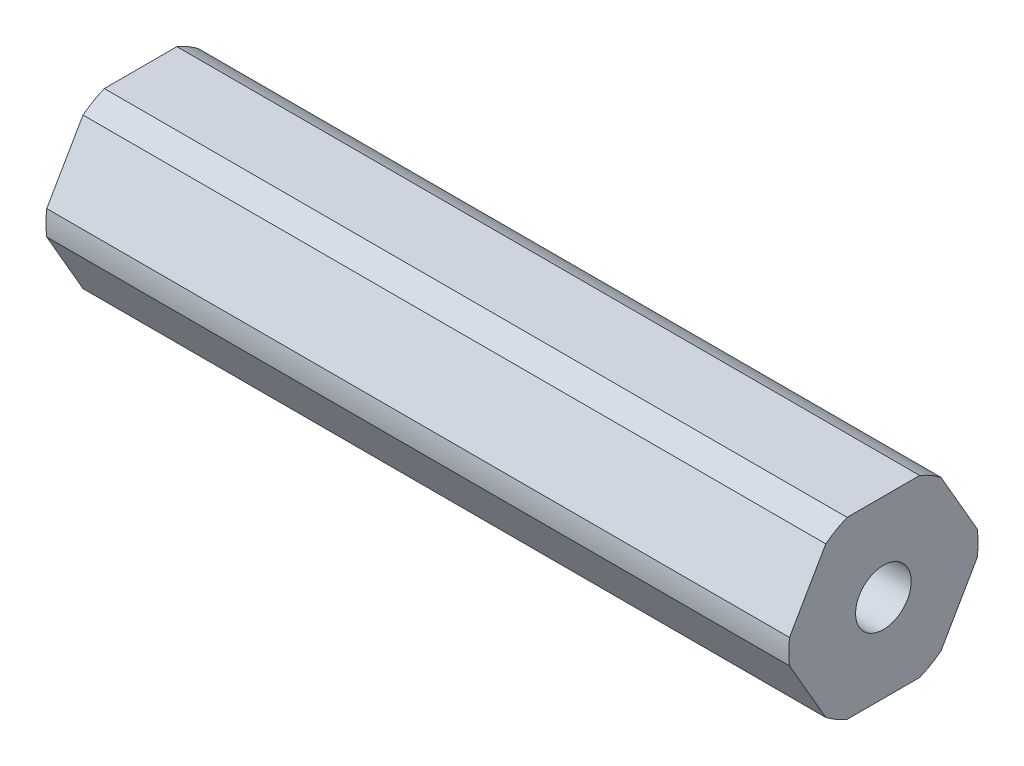
ISO-10303-21;
HEADER;
FILE_DESCRIPTION(('STEP AP214'),'2;1');
FILE_NAME('part.step','',(''),(''),'','','');
FILE_SCHEMA(('AUTOMOTIVE_DESIGN { 1 0 10303 214 1 1 1 1 }'));
ENDSEC;
DATA;
#1=APPLICATION_CONTEXT('core data for automotive mechanical design processes');
#2=APPLICATION_PROTOCOL_DEFINITION('international standard','automotive_design',2000,#1);
#3=PRODUCT_CONTEXT('',#1,'mechanical');
#4=PRODUCT('Part','Part','',(#3));
#5=PRODUCT_RELATED_PRODUCT_CATEGORY('part','',(#4));
#6=PRODUCT_DEFINITION_FORMATION('','',#4);
#7=PRODUCT_DEFINITION_CONTEXT('part definition',#1,'design');
#8=PRODUCT_DEFINITION('design','',#6,#7);
#9=PRODUCT_DEFINITION_SHAPE('','',#8);
#10=(LENGTH_UNIT() NAMED_UNIT(*) SI_UNIT(.MILLI.,.METRE.));
#11=(NAMED_UNIT(*) PLANE_ANGLE_UNIT() SI_UNIT($,.RADIAN.));
#12=(NAMED_UNIT(*) SI_UNIT($,.STERADIAN.) SOLID_ANGLE_UNIT());
#13=UNCERTAINTY_MEASURE_WITH_UNIT(LENGTH_MEASURE(1.E-05),#10,'distance_accuracy_value','');
#14=(GEOMETRIC_REPRESENTATION_CONTEXT(3) GLOBAL_UNCERTAINTY_ASSIGNED_CONTEXT((#13)) GLOBAL_UNIT_ASSIGNED_CONTEXT((#10,
#11,#12)) REPRESENTATION_CONTEXT('',''));
#15=CARTESIAN_POINT('',(0.,0.,0.));
#16=DIRECTION('',(0.,0.,1.));
#17=DIRECTION('',(1.,0.,0.));
#18=AXIS2_PLACEMENT_3D('',#15,#16,#17);
#19=CARTESIAN_POINT('',(26.9621,3.17499999999999,-5.49926131403116));
#20=DIRECTION('',(0.,-0.500000000000001,0.866025403784438));
#21=DIRECTION('',(0.,-0.866025403784438,-0.500000000000001));
#22=AXIS2_PLACEMENT_3D('',#19,#20,#21);
#23=PLANE('',#22);
#24=DIRECTION('',(0.,0.866025403784438,0.500000000000001));
#25=VECTOR('',#24,1.);
#26=CARTESIAN_POINT('',(-26.9621,3.17499999999999,-5.49926131403116));
#27=LINE('',#26,#25);
#28=CARTESIAN_POINT('',(-26.9621,0.89303957103212,-6.81675178197584));
#29=VERTEX_POINT('',#28);
#30=CARTESIAN_POINT('',(-26.9621,5.45696042896787,-4.18177084608648));
#31=VERTEX_POINT('',#30);
#32=EDGE_CURVE('E164',#29,#31,#27,.T.);
#33=ORIENTED_EDGE('',*,*,#32,.T.);
#34=DIRECTION('',(-1.,0.,0.));
#35=VECTOR('',#34,1.);
#36=CARTESIAN_POINT('',(26.9621,5.45696042896787,-4.18177084608648));
#37=LINE('',#36,#35);
#38=CARTESIAN_POINT('',(26.9621,5.45696042896787,-4.18177084608648));
#39=VERTEX_POINT('',#38);
#40=EDGE_CURVE('E11',#39,#31,#37,.T.);
#41=ORIENTED_EDGE('',*,*,#40,.F.);
#42=DIRECTION('',(0.,0.866025403784438,0.500000000000001));
#43=VECTOR('',#42,1.);
#44=CARTESIAN_POINT('',(26.9621,3.17499999999999,-5.49926131403116));
#45=LINE('',#44,#43);
#46=CARTESIAN_POINT('',(26.9621,0.89303957103212,-6.81675178197584));
#47=VERTEX_POINT('',#46);
#48=EDGE_CURVE('E223',#47,#39,#45,.T.);
#49=ORIENTED_EDGE('',*,*,#48,.F.);
#50=DIRECTION('',(-1.,0.,0.));
#51=VECTOR('',#50,1.);
#52=CARTESIAN_POINT('',(26.9621,0.89303957103212,-6.81675178197584));
#53=LINE('',#52,#51);
#54=EDGE_CURVE('E157',#47,#29,#53,.T.);
#55=ORIENTED_EDGE('',*,*,#54,.T.);
#56=EDGE_LOOP('',(#33,#41,#49,#55));
#57=FACE_BOUND('',#56,.T.);
#58=ADVANCED_FACE('F39',(#57),#23,.F.);
#59=CARTESIAN_POINT('',(26.9621,0.,0.));
#60=DIRECTION('',(-1.,0.,0.));
#61=DIRECTION('',(0.,0.,1.));
#62=AXIS2_PLACEMENT_3D('',#59,#60,#61);
#63=CYLINDRICAL_SURFACE('',#62,6.874999966);
#64=CARTESIAN_POINT('',(-26.9621,0.,0.));
#65=DIRECTION('',(1.,0.,0.));
#66=DIRECTION('',(0.,0.,-1.));
#67=AXIS2_PLACEMENT_3D('',#64,#65,#66);
#68=CIRCLE('',#67,6.874999966);
#69=CARTESIAN_POINT('',(-26.9621,6.34999999999998,-2.63498093588933));
#70=VERTEX_POINT('',#69);
#71=EDGE_CURVE('E167',#31,#70,#68,.T.);
#72=ORIENTED_EDGE('',*,*,#71,.T.);
#73=DIRECTION('',(-1.,0.,0.));
#74=VECTOR('',#73,1.);
#75=CARTESIAN_POINT('',(26.9621,6.34999999999998,-2.63498093588933));
#76=LINE('',#75,#74);
#77=CARTESIAN_POINT('',(26.9621,6.34999999999998,-2.63498093588933));
#78=VERTEX_POINT('',#77);
#79=EDGE_CURVE('E48',#78,#70,#76,.T.);
#80=ORIENTED_EDGE('',*,*,#79,.F.);
#81=CARTESIAN_POINT('',(26.9621,0.,0.));
#82=DIRECTION('',(1.,0.,0.));
#83=DIRECTION('',(0.,0.,-1.));
#84=AXIS2_PLACEMENT_3D('',#81,#82,#83);
#85=CIRCLE('',#84,6.874999966);
#86=EDGE_CURVE('E111',#39,#78,#85,.T.);
#87=ORIENTED_EDGE('',*,*,#86,.F.);
#88=ORIENTED_EDGE('',*,*,#40,.T.);
#89=EDGE_LOOP('',(#72,#80,#87,#88));
#90=FACE_BOUND('',#89,.T.);
#91=ADVANCED_FACE('F258',(#90),#63,.T.);
#92=CARTESIAN_POINT('',(26.9621,6.34999999999997,0.));
#93=DIRECTION('',(0.,-1.,0.));
#94=DIRECTION('',(0.,0.,-1.));
#95=AXIS2_PLACEMENT_3D('',#92,#93,#94);
#96=PLANE('',#95);
#97=DIRECTION('',(0.,0.,1.));
#98=VECTOR('',#97,1.);
#99=CARTESIAN_POINT('',(-26.9621,6.34999999999997,0.));
#100=LINE('',#99,#98);
#101=CARTESIAN_POINT('',(-26.9621,6.34999999999997,2.63498093588938));
#102=VERTEX_POINT('',#101);
#103=EDGE_CURVE('E169',#70,#102,#100,.T.);
#104=ORIENTED_EDGE('',*,*,#103,.T.);
#105=DIRECTION('',(-1.,0.,0.));
#106=VECTOR('',#105,1.);
#107=CARTESIAN_POINT('',(26.9621,6.34999999999997,2.63498093588938));
#108=LINE('',#107,#106);
#109=CARTESIAN_POINT('',(26.9621,6.34999999999997,2.63498093588938));
#110=VERTEX_POINT('',#109);
#111=EDGE_CURVE('E199',#110,#102,#108,.T.);
#112=ORIENTED_EDGE('',*,*,#111,.F.);
#113=DIRECTION('',(0.,0.,1.));
#114=VECTOR('',#113,1.);
#115=CARTESIAN_POINT('',(26.9621,6.34999999999997,0.));
#116=LINE('',#115,#114);
#117=EDGE_CURVE('E207',#78,#110,#116,.T.);
#118=ORIENTED_EDGE('',*,*,#117,.F.);
#119=ORIENTED_EDGE('',*,*,#79,.T.);
#120=EDGE_LOOP('',(#104,#112,#118,#119));
#121=FACE_BOUND('',#120,.T.);
#122=ADVANCED_FACE('F205',(#121),#96,.F.);
#123=CARTESIAN_POINT('',(-26.9621,5.45696042896784,4.18177084608651));
#124=VERTEX_POINT('',#123);
#125=EDGE_CURVE('E170',#102,#124,#68,.T.);
#126=ORIENTED_EDGE('',*,*,#125,.T.);
#127=DIRECTION('',(-1.,0.,0.));
#128=VECTOR('',#127,1.);
#129=CARTESIAN_POINT('',(26.9621,5.45696042896784,4.18177084608651));
#130=LINE('',#129,#128);
#131=CARTESIAN_POINT('',(26.9621,5.45696042896784,4.18177084608651));
#132=VERTEX_POINT('',#131);
#133=EDGE_CURVE('E196',#132,#124,#130,.T.);
#134=ORIENTED_EDGE('',*,*,#133,.F.);
#135=EDGE_CURVE('E229',#110,#132,#85,.T.);
#136=ORIENTED_EDGE('',*,*,#135,.F.);
#137=ORIENTED_EDGE('',*,*,#111,.T.);
#138=EDGE_LOOP('',(#126,#134,#136,#137));
#139=FACE_BOUND('',#138,.T.);
#140=ADVANCED_FACE('F240',(#139),#63,.T.);
#141=CARTESIAN_POINT('',(26.9621,3.17499999999995,5.49926131403118));
#142=DIRECTION('',(0.,-0.499999999999995,-0.866025403784442));
#143=DIRECTION('',(0.,0.866025403784442,-0.499999999999995));
#144=AXIS2_PLACEMENT_3D('',#141,#142,#143);
#145=PLANE('',#144);
#146=DIRECTION('',(0.,-0.866025403784442,0.499999999999995));
#147=VECTOR('',#146,1.);
#148=CARTESIAN_POINT('',(-26.9621,3.17499999999995,5.49926131403118));
#149=LINE('',#148,#147);
#150=CARTESIAN_POINT('',(-26.9621,0.893039571032066,6.81675178197585));
#151=VERTEX_POINT('',#150);
#152=EDGE_CURVE('E172',#124,#151,#149,.T.);
#153=ORIENTED_EDGE('',*,*,#152,.T.);
#154=DIRECTION('',(-1.,0.,0.));
#155=VECTOR('',#154,1.);
#156=CARTESIAN_POINT('',(26.9621,0.893039571032066,6.81675178197585));
#157=LINE('',#156,#155);
#158=CARTESIAN_POINT('',(26.9621,0.893039571032066,6.81675178197585));
#159=VERTEX_POINT('',#158);
#160=EDGE_CURVE('E193',#159,#151,#157,.T.);
#161=ORIENTED_EDGE('',*,*,#160,.F.);
#162=DIRECTION('',(0.,-0.866025403784442,0.499999999999995));
#163=VECTOR('',#162,1.);
#164=CARTESIAN_POINT('',(26.9621,3.17499999999995,5.49926131403118));
#165=LINE('',#164,#163);
#166=EDGE_CURVE('E231',#132,#159,#165,.T.);
#167=ORIENTED_EDGE('',*,*,#166,.F.);
#168=ORIENTED_EDGE('',*,*,#133,.T.);
#169=EDGE_LOOP('',(#153,#161,#167,#168));
#170=FACE_BOUND('',#169,.T.);
#171=ADVANCED_FACE('F242',(#170),#145,.F.);
#172=CARTESIAN_POINT('',(-26.9621,-0.893039571032163,6.81675178197583));
#173=VERTEX_POINT('',#172);
#174=EDGE_CURVE('E174',#151,#173,#68,.T.);
#175=ORIENTED_EDGE('',*,*,#174,.T.);
#176=DIRECTION('',(-1.,0.,0.));
#177=VECTOR('',#176,1.);
#178=CARTESIAN_POINT('',(26.9621,-0.893039571032163,6.81675178197583));
#179=LINE('',#178,#177);
#180=CARTESIAN_POINT('',(26.9621,-0.893039571032163,6.81675178197583));
#181=VERTEX_POINT('',#180);
#182=EDGE_CURVE('E190',#181,#173,#179,.T.);
#183=ORIENTED_EDGE('',*,*,#182,.F.);
#184=EDGE_CURVE('E232',#159,#181,#85,.T.);
#185=ORIENTED_EDGE('',*,*,#184,.F.);
#186=ORIENTED_EDGE('',*,*,#160,.T.);
#187=EDGE_LOOP('',(#175,#183,#185,#186));
#188=FACE_BOUND('',#187,.T.);
#189=ADVANCED_FACE('F243',(#188),#63,.T.);
#190=CARTESIAN_POINT('',(26.9621,-3.17500000000003,5.49926131403114));
#191=DIRECTION('',(0.,0.500000000000007,-0.866025403784435));
#192=DIRECTION('',(0.,0.866025403784435,0.500000000000007));
#193=AXIS2_PLACEMENT_3D('',#190,#191,#192);
#194=PLANE('',#193);
#195=DIRECTION('',(0.,-0.866025403784435,-0.500000000000007));
#196=VECTOR('',#195,1.);
#197=CARTESIAN_POINT('',(-26.9621,-3.17500000000003,5.49926131403114));
#198=LINE('',#197,#196);
#199=CARTESIAN_POINT('',(-26.9621,-5.4569604289679,4.18177084608644));
#200=VERTEX_POINT('',#199);
#201=EDGE_CURVE('E175',#173,#200,#198,.T.);
#202=ORIENTED_EDGE('',*,*,#201,.T.);
#203=DIRECTION('',(-1.,0.,0.));
#204=VECTOR('',#203,1.);
#205=CARTESIAN_POINT('',(26.9621,-5.4569604289679,4.18177084608644));
#206=LINE('',#205,#204);
#207=CARTESIAN_POINT('',(26.9621,-5.4569604289679,4.18177084608644));
#208=VERTEX_POINT('',#207);
#209=EDGE_CURVE('E187',#208,#200,#206,.T.);
#210=ORIENTED_EDGE('',*,*,#209,.F.);
#211=DIRECTION('',(0.,-0.866025403784435,-0.500000000000007));
#212=VECTOR('',#211,1.);
#213=CARTESIAN_POINT('',(26.9621,-3.17500000000003,5.49926131403114));
#214=LINE('',#213,#212);
#215=EDGE_CURVE('E233',#181,#208,#214,.T.);
#216=ORIENTED_EDGE('',*,*,#215,.F.);
#217=ORIENTED_EDGE('',*,*,#182,.T.);
#218=EDGE_LOOP('',(#202,#210,#216,#217));
#219=FACE_BOUND('',#218,.T.);
#220=ADVANCED_FACE('F246',(#219),#194,.F.);
#221=CARTESIAN_POINT('',(-26.9621,-6.35,2.63498093588929));
#222=VERTEX_POINT('',#221);
#223=EDGE_CURVE('E177',#200,#222,#68,.T.);
#224=ORIENTED_EDGE('',*,*,#223,.T.);
#225=DIRECTION('',(-1.,0.,0.));
#226=VECTOR('',#225,1.);
#227=CARTESIAN_POINT('',(26.9621,-6.35,2.63498093588929));
#228=LINE('',#227,#226);
#229=CARTESIAN_POINT('',(26.9621,-6.35,2.63498093588929));
#230=VERTEX_POINT('',#229);
#231=EDGE_CURVE('E184',#230,#222,#228,.T.);
#232=ORIENTED_EDGE('',*,*,#231,.F.);
#233=EDGE_CURVE('E147',#208,#230,#85,.T.);
#234=ORIENTED_EDGE('',*,*,#233,.F.);
#235=ORIENTED_EDGE('',*,*,#209,.T.);
#236=EDGE_LOOP('',(#224,#232,#234,#235));
#237=FACE_BOUND('',#236,.T.);
#238=ADVANCED_FACE('F248',(#237),#63,.T.);
#239=CARTESIAN_POINT('',(26.9621,-6.34999999999997,0.));
#240=DIRECTION('',(0.,1.,0.));
#241=DIRECTION('',(0.,0.,1.));
#242=AXIS2_PLACEMENT_3D('',#239,#240,#241);
#243=PLANE('',#242);
#244=DIRECTION('',(0.,0.,-1.));
#245=VECTOR('',#244,1.);
#246=CARTESIAN_POINT('',(-26.9621,-6.34999999999997,0.));
#247=LINE('',#246,#245);
#248=CARTESIAN_POINT('',(-26.9621,-6.34999999999994,-2.63498093588942));
#249=VERTEX_POINT('',#248);
#250=EDGE_CURVE('E178',#222,#249,#247,.T.);
#251=ORIENTED_EDGE('',*,*,#250,.T.);
#252=DIRECTION('',(-1.,0.,0.));
#253=VECTOR('',#252,1.);
#254=CARTESIAN_POINT('',(26.9621,-6.34999999999994,-2.63498093588942));
#255=LINE('',#254,#253);
#256=CARTESIAN_POINT('',(26.9621,-6.34999999999994,-2.63498093588942));
#257=VERTEX_POINT('',#256);
#258=EDGE_CURVE('E152',#257,#249,#255,.T.);
#259=ORIENTED_EDGE('',*,*,#258,.F.);
#260=DIRECTION('',(0.,0.,-1.));
#261=VECTOR('',#260,1.);
#262=CARTESIAN_POINT('',(26.9621,-6.34999999999997,0.));
#263=LINE('',#262,#261);
#264=EDGE_CURVE('E142',#230,#257,#263,.T.);
#265=ORIENTED_EDGE('',*,*,#264,.F.);
#266=ORIENTED_EDGE('',*,*,#231,.T.);
#267=EDGE_LOOP('',(#251,#259,#265,#266));
#268=FACE_BOUND('',#267,.T.);
#269=ADVANCED_FACE('F251',(#268),#243,.F.);
#270=CARTESIAN_POINT('',(-26.9621,-5.4569604289678,-4.18177084608657));
#271=VERTEX_POINT('',#270);
#272=EDGE_CURVE('E151',#249,#271,#68,.T.);
#273=ORIENTED_EDGE('',*,*,#272,.T.);
#274=DIRECTION('',(-1.,0.,0.));
#275=VECTOR('',#274,1.);
#276=CARTESIAN_POINT('',(26.9621,-5.4569604289678,-4.18177084608657));
#277=LINE('',#276,#275);
#278=CARTESIAN_POINT('',(26.9621,-5.4569604289678,-4.18177084608657));
#279=VERTEX_POINT('',#278);
#280=EDGE_CURVE('E148',#279,#271,#277,.T.);
#281=ORIENTED_EDGE('',*,*,#280,.F.);
#282=EDGE_CURVE('E136',#257,#279,#85,.T.);
#283=ORIENTED_EDGE('',*,*,#282,.F.);
#284=ORIENTED_EDGE('',*,*,#258,.T.);
#285=EDGE_LOOP('',(#273,#281,#283,#284));
#286=FACE_BOUND('',#285,.T.);
#287=ADVANCED_FACE('F149',(#286),#63,.T.);
#288=CARTESIAN_POINT('',(26.9621,-3.17499999999997,-5.4992613140312));
#289=DIRECTION('',(0.,0.499999999999995,0.866025403784441));
#290=DIRECTION('',(0.,-0.866025403784441,0.499999999999995));
#291=AXIS2_PLACEMENT_3D('',#288,#289,#290);
#292=PLANE('',#291);
#293=DIRECTION('',(0.,0.866025403784441,-0.499999999999995));
#294=VECTOR('',#293,1.);
#295=CARTESIAN_POINT('',(-26.9621,-3.17499999999997,-5.4992613140312));
#296=LINE('',#295,#294);
#297=CARTESIAN_POINT('',(-26.9621,-0.893039571032135,-6.81675178197584));
#298=VERTEX_POINT('',#297);
#299=EDGE_CURVE('E97',#271,#298,#296,.T.);
#300=ORIENTED_EDGE('',*,*,#299,.T.);
#301=DIRECTION('',(-1.,0.,0.));
#302=VECTOR('',#301,1.);
#303=CARTESIAN_POINT('',(26.9621,-0.893039571032135,-6.81675178197584));
#304=LINE('',#303,#302);
#305=CARTESIAN_POINT('',(26.9621,-0.893039571032135,-6.81675178197584));
#306=VERTEX_POINT('',#305);
#307=EDGE_CURVE('E153',#306,#298,#304,.T.);
#308=ORIENTED_EDGE('',*,*,#307,.F.);
#309=DIRECTION('',(0.,0.866025403784441,-0.499999999999995));
#310=VECTOR('',#309,1.);
#311=CARTESIAN_POINT('',(26.9621,-3.17499999999997,-5.4992613140312));
#312=LINE('',#311,#310);
#313=EDGE_CURVE('E140',#279,#306,#312,.T.);
#314=ORIENTED_EDGE('',*,*,#313,.F.);
#315=ORIENTED_EDGE('',*,*,#280,.T.);
#316=EDGE_LOOP('',(#300,#308,#314,#315));
#317=FACE_BOUND('',#316,.T.);
#318=ADVANCED_FACE('F155',(#317),#292,.F.);
#319=CARTESIAN_POINT('',(26.9621,0.,0.));
#320=DIRECTION('',(-1.,0.,0.));
#321=DIRECTION('',(0.,0.,1.));
#322=AXIS2_PLACEMENT_3D('',#319,#320,#321);
#323=CYLINDRICAL_SURFACE('',#322,2.0193);
#324=CARTESIAN_POINT('',(26.9621,0.,0.));
#325=DIRECTION('',(1.,0.,0.));
#326=DIRECTION('',(0.,0.,-1.));
#327=AXIS2_PLACEMENT_3D('',#324,#325,#326);
#328=CIRCLE('',#327,2.0193);
#329=CARTESIAN_POINT('',(26.9621,0.,-2.0193));
#330=VERTEX_POINT('',#329);
#331=EDGE_CURVE('E221',#330,#330,#328,.T.);
#332=ORIENTED_EDGE('',*,*,#331,.T.);
#333=EDGE_LOOP('',(#332));
#334=FACE_BOUND('',#333,.T.);
#335=CARTESIAN_POINT('',(-26.9621,0.,0.));
#336=DIRECTION('',(1.,0.,0.));
#337=DIRECTION('',(0.,0.,-1.));
#338=AXIS2_PLACEMENT_3D('',#335,#336,#337);
#339=CIRCLE('',#338,2.0193);
#340=CARTESIAN_POINT('',(-26.9621,0.,-2.0193));
#341=VERTEX_POINT('',#340);
#342=EDGE_CURVE('E161',#341,#341,#339,.T.);
#343=ORIENTED_EDGE('',*,*,#342,.F.);
#344=EDGE_LOOP('',(#343));
#345=FACE_BOUND('',#344,.T.);
#346=ADVANCED_FACE('F41',(#334,#345),#323,.F.);
#347=EDGE_CURVE('E103',#298,#29,#68,.T.);
#348=ORIENTED_EDGE('',*,*,#347,.T.);
#349=ORIENTED_EDGE('',*,*,#54,.F.);
#350=EDGE_CURVE('E56',#306,#47,#85,.T.);
#351=ORIENTED_EDGE('',*,*,#350,.F.);
#352=ORIENTED_EDGE('',*,*,#307,.T.);
#353=EDGE_LOOP('',(#348,#349,#351,#352));
#354=FACE_BOUND('',#353,.T.);
#355=ADVANCED_FACE('F255',(#354),#63,.T.);
#356=CARTESIAN_POINT('',(26.9621,0.,0.));
#357=DIRECTION('',(1.,0.,0.));
#358=DIRECTION('',(0.,0.,-1.));
#359=AXIS2_PLACEMENT_3D('',#356,#357,#358);
#360=PLANE('',#359);
#361=ORIENTED_EDGE('',*,*,#331,.F.);
#362=EDGE_LOOP('',(#361));
#363=FACE_BOUND('',#362,.T.);
#364=ORIENTED_EDGE('',*,*,#48,.T.);
#365=ORIENTED_EDGE('',*,*,#86,.T.);
#366=ORIENTED_EDGE('',*,*,#117,.T.);
#367=ORIENTED_EDGE('',*,*,#135,.T.);
#368=ORIENTED_EDGE('',*,*,#166,.T.);
#369=ORIENTED_EDGE('',*,*,#184,.T.);
#370=ORIENTED_EDGE('',*,*,#215,.T.);
#371=ORIENTED_EDGE('',*,*,#233,.T.);
#372=ORIENTED_EDGE('',*,*,#264,.T.);
#373=ORIENTED_EDGE('',*,*,#282,.T.);
#374=ORIENTED_EDGE('',*,*,#313,.T.);
#375=ORIENTED_EDGE('',*,*,#350,.T.);
#376=EDGE_LOOP('',(#364,#365,#366,#367,#368,#369,#370,#371,#372,#373,#374,#375));
#377=FACE_BOUND('',#376,.T.);
#378=ADVANCED_FACE('F138',(#363,#377),#360,.T.);
#379=CARTESIAN_POINT('',(-26.9621,0.,0.));
#380=DIRECTION('',(1.,0.,0.));
#381=DIRECTION('',(0.,0.,-1.));
#382=AXIS2_PLACEMENT_3D('',#379,#380,#381);
#383=PLANE('',#382);
#384=ORIENTED_EDGE('',*,*,#342,.T.);
#385=EDGE_LOOP('',(#384));
#386=FACE_BOUND('',#385,.T.);
#387=ORIENTED_EDGE('',*,*,#32,.F.);
#388=ORIENTED_EDGE('',*,*,#347,.F.);
#389=ORIENTED_EDGE('',*,*,#299,.F.);
#390=ORIENTED_EDGE('',*,*,#272,.F.);
#391=ORIENTED_EDGE('',*,*,#250,.F.);
#392=ORIENTED_EDGE('',*,*,#223,.F.);
#393=ORIENTED_EDGE('',*,*,#201,.F.);
#394=ORIENTED_EDGE('',*,*,#174,.F.);
#395=ORIENTED_EDGE('',*,*,#152,.F.);
#396=ORIENTED_EDGE('',*,*,#125,.F.);
#397=ORIENTED_EDGE('',*,*,#103,.F.);
#398=ORIENTED_EDGE('',*,*,#71,.F.);
#399=EDGE_LOOP('',(#387,#388,#389,#390,#391,#392,#393,#394,#395,#396,#397,#398));
#400=FACE_BOUND('',#399,.T.);
#401=ADVANCED_FACE('F211',(#386,#400),#383,.F.);
#402=CLOSED_SHELL('',(#58,#91,#122,#140,#171,#189,#220,#238,#269,#287,#318,#346,#355,#378,#401));
#403=MANIFOLD_SOLID_BREP('B2',#402);
#404=ADVANCED_BREP_SHAPE_REPRESENTATION('',(#18,#403),#14);
#405=SHAPE_DEFINITION_REPRESENTATION(#9,#404);
ENDSEC;
END-ISO-10303-21;
